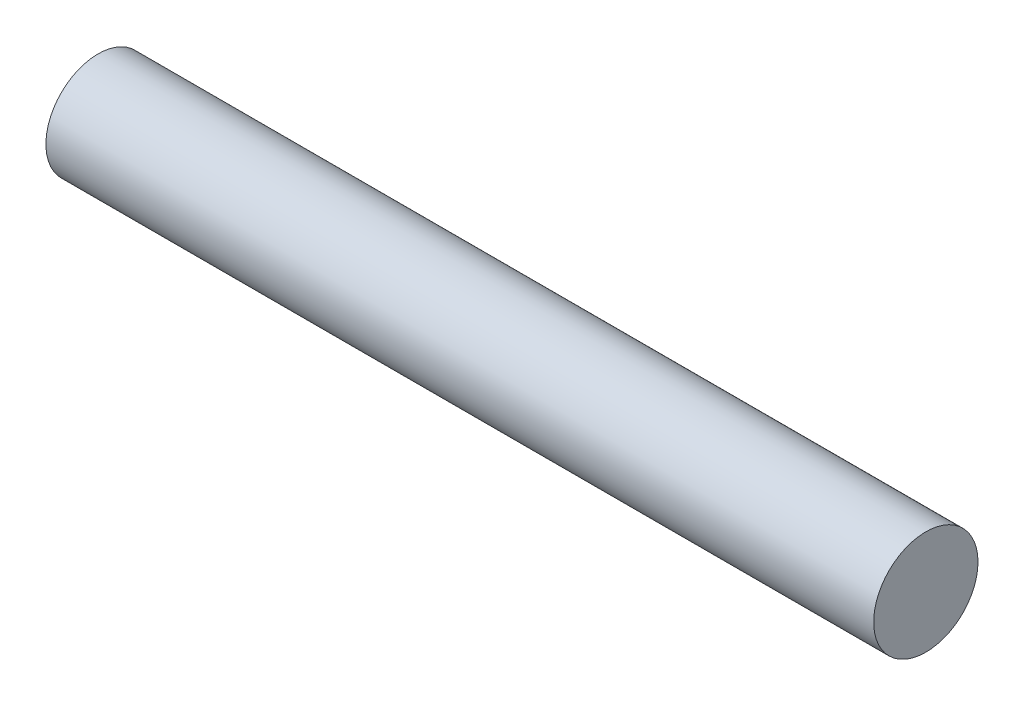
ISO-10303-21;
HEADER;
FILE_DESCRIPTION(('STEP AP214'),'2;1');
FILE_NAME('part.step','',(''),(''),'','','');
FILE_SCHEMA(('AUTOMOTIVE_DESIGN { 1 0 10303 214 1 1 1 1 }'));
ENDSEC;
DATA;
#1=APPLICATION_CONTEXT('core data for automotive mechanical design processes');
#2=APPLICATION_PROTOCOL_DEFINITION('international standard','automotive_design',2000,#1);
#3=PRODUCT_CONTEXT('',#1,'mechanical');
#4=PRODUCT('Part','Part','',(#3));
#5=PRODUCT_RELATED_PRODUCT_CATEGORY('part','',(#4));
#6=PRODUCT_DEFINITION_FORMATION('','',#4);
#7=PRODUCT_DEFINITION_CONTEXT('part definition',#1,'design');
#8=PRODUCT_DEFINITION('design','',#6,#7);
#9=PRODUCT_DEFINITION_SHAPE('','',#8);
#10=(LENGTH_UNIT() NAMED_UNIT(*) SI_UNIT(.MILLI.,.METRE.));
#11=(NAMED_UNIT(*) PLANE_ANGLE_UNIT() SI_UNIT($,.RADIAN.));
#12=(NAMED_UNIT(*) SI_UNIT($,.STERADIAN.) SOLID_ANGLE_UNIT());
#13=UNCERTAINTY_MEASURE_WITH_UNIT(LENGTH_MEASURE(1.E-05),#10,'distance_accuracy_value','');
#14=(GEOMETRIC_REPRESENTATION_CONTEXT(3) GLOBAL_UNCERTAINTY_ASSIGNED_CONTEXT((#13)) GLOBAL_UNIT_ASSIGNED_CONTEXT((#10,
#11,#12)) REPRESENTATION_CONTEXT('',''));
#15=CARTESIAN_POINT('',(0.,0.,0.));
#16=DIRECTION('',(0.,0.,1.));
#17=DIRECTION('',(1.,0.,0.));
#18=AXIS2_PLACEMENT_3D('',#15,#16,#17);
#19=CARTESIAN_POINT('',(47.6000064,0.,0.));
#20=DIRECTION('',(-1.,0.,0.));
#21=DIRECTION('',(0.,0.,1.));
#22=AXIS2_PLACEMENT_3D('',#19,#20,#21);
#23=CYLINDRICAL_SURFACE('',#22,3.);
#24=CARTESIAN_POINT('',(47.6000064,0.,0.));
#25=DIRECTION('',(1.,0.,0.));
#26=DIRECTION('',(0.,0.,-1.));
#27=AXIS2_PLACEMENT_3D('',#24,#25,#26);
#28=CIRCLE('',#27,3.);
#29=CARTESIAN_POINT('',(47.6000064,0.,-3.));
#30=VERTEX_POINT('',#29);
#31=EDGE_CURVE('E10',#30,#30,#28,.T.);
#32=ORIENTED_EDGE('',*,*,#31,.F.);
#33=EDGE_LOOP('',(#32));
#34=FACE_BOUND('',#33,.T.);
#35=CARTESIAN_POINT('',(0.,0.,0.));
#36=DIRECTION('',(1.,0.,0.));
#37=DIRECTION('',(0.,0.,-1.));
#38=AXIS2_PLACEMENT_3D('',#35,#36,#37);
#39=CIRCLE('',#38,3.);
#40=CARTESIAN_POINT('',(0.,0.,-3.));
#41=VERTEX_POINT('',#40);
#42=EDGE_CURVE('E46',#41,#41,#39,.T.);
#43=ORIENTED_EDGE('',*,*,#42,.T.);
#44=EDGE_LOOP('',(#43));
#45=FACE_BOUND('',#44,.T.);
#46=ADVANCED_FACE('F43',(#34,#45),#23,.T.);
#47=CARTESIAN_POINT('',(47.6000064,0.,0.));
#48=DIRECTION('',(1.,0.,0.));
#49=DIRECTION('',(0.,0.,-1.));
#50=AXIS2_PLACEMENT_3D('',#47,#48,#49);
#51=PLANE('',#50);
#52=ORIENTED_EDGE('',*,*,#31,.T.);
#53=EDGE_LOOP('',(#52));
#54=FACE_BOUND('',#53,.T.);
#55=ADVANCED_FACE('F58',(#54),#51,.T.);
#56=CARTESIAN_POINT('',(0.,0.,0.));
#57=DIRECTION('',(1.,0.,0.));
#58=DIRECTION('',(0.,0.,-1.));
#59=AXIS2_PLACEMENT_3D('',#56,#57,#58);
#60=PLANE('',#59);
#61=ORIENTED_EDGE('',*,*,#42,.F.);
#62=EDGE_LOOP('',(#61));
#63=FACE_BOUND('',#62,.T.);
#64=ADVANCED_FACE('F59',(#63),#60,.F.);
#65=CLOSED_SHELL('',(#46,#55,#64));
#66=MANIFOLD_SOLID_BREP('B2',#65);
#67=ADVANCED_BREP_SHAPE_REPRESENTATION('',(#18,#66),#14);
#68=SHAPE_DEFINITION_REPRESENTATION(#9,#67);
ENDSEC;
END-ISO-10303-21;
